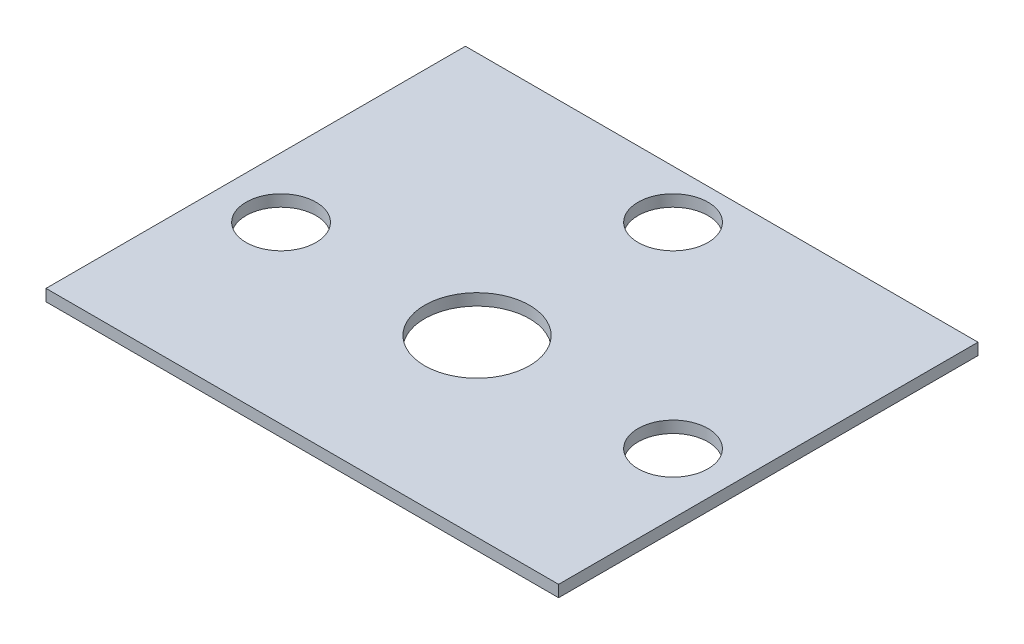
ISO-10303-21;
HEADER;
FILE_DESCRIPTION(('STEP AP214'),'2;1');
FILE_NAME('part.step','',(''),(''),'','','');
FILE_SCHEMA(('AUTOMOTIVE_DESIGN { 1 0 10303 214 1 1 1 1 }'));
ENDSEC;
DATA;
#1=APPLICATION_CONTEXT('core data for automotive mechanical design processes');
#2=APPLICATION_PROTOCOL_DEFINITION('international standard','automotive_design',2000,#1);
#3=PRODUCT_CONTEXT('',#1,'mechanical');
#4=PRODUCT('Part','Part','',(#3));
#5=PRODUCT_RELATED_PRODUCT_CATEGORY('part','',(#4));
#6=PRODUCT_DEFINITION_FORMATION('','',#4);
#7=PRODUCT_DEFINITION_CONTEXT('part definition',#1,'design');
#8=PRODUCT_DEFINITION('design','',#6,#7);
#9=PRODUCT_DEFINITION_SHAPE('','',#8);
#10=(LENGTH_UNIT() NAMED_UNIT(*) SI_UNIT(.MILLI.,.METRE.));
#11=(NAMED_UNIT(*) PLANE_ANGLE_UNIT() SI_UNIT($,.RADIAN.));
#12=(NAMED_UNIT(*) SI_UNIT($,.STERADIAN.) SOLID_ANGLE_UNIT());
#13=UNCERTAINTY_MEASURE_WITH_UNIT(LENGTH_MEASURE(1.E-05),#10,'distance_accuracy_value','');
#14=(GEOMETRIC_REPRESENTATION_CONTEXT(3) GLOBAL_UNCERTAINTY_ASSIGNED_CONTEXT((#13)) GLOBAL_UNIT_ASSIGNED_CONTEXT((#10,
#11,#12)) REPRESENTATION_CONTEXT('',''));
#15=CARTESIAN_POINT('',(0.,0.,0.));
#16=DIRECTION('',(0.,0.,1.));
#17=DIRECTION('',(1.,0.,0.));
#18=AXIS2_PLACEMENT_3D('',#15,#16,#17);
#19=CARTESIAN_POINT('',(0.,1.5875,0.));
#20=DIRECTION('',(0.,-1.,0.));
#21=DIRECTION('',(0.,0.,-1.));
#22=AXIS2_PLACEMENT_3D('',#19,#20,#21);
#23=PLANE('',#22);
#24=DIRECTION('',(0.,0.,-1.));
#25=VECTOR('',#24,1.);
#26=CARTESIAN_POINT('',(69.85,1.5875,57.15));
#27=LINE('',#26,#25);
#28=CARTESIAN_POINT('',(69.85,1.5875,57.15));
#29=VERTEX_POINT('',#28);
#30=CARTESIAN_POINT('',(69.85,1.5875,-57.15));
#31=VERTEX_POINT('',#30);
#32=EDGE_CURVE('E96',#29,#31,#27,.T.);
#33=ORIENTED_EDGE('',*,*,#32,.T.);
#34=DIRECTION('',(-1.,0.,0.));
#35=VECTOR('',#34,1.);
#36=CARTESIAN_POINT('',(-69.85,1.5875,-57.15));
#37=LINE('',#36,#35);
#38=CARTESIAN_POINT('',(-69.85,1.5875,-57.15));
#39=VERTEX_POINT('',#38);
#40=EDGE_CURVE('E91',#31,#39,#37,.T.);
#41=ORIENTED_EDGE('',*,*,#40,.T.);
#42=DIRECTION('',(0.,0.,1.));
#43=VECTOR('',#42,1.);
#44=CARTESIAN_POINT('',(-69.85,1.5875,57.15));
#45=LINE('',#44,#43);
#46=CARTESIAN_POINT('',(-69.85,1.5875,57.15));
#47=VERTEX_POINT('',#46);
#48=EDGE_CURVE('E94',#39,#47,#45,.T.);
#49=ORIENTED_EDGE('',*,*,#48,.T.);
#50=DIRECTION('',(1.,0.,0.));
#51=VECTOR('',#50,1.);
#52=CARTESIAN_POINT('',(-69.85,1.5875,57.15));
#53=LINE('',#52,#51);
#54=EDGE_CURVE('E61',#47,#29,#53,.T.);
#55=ORIENTED_EDGE('',*,*,#54,.T.);
#56=EDGE_LOOP('',(#33,#41,#49,#55));
#57=FACE_BOUND('',#56,.T.);
#58=CARTESIAN_POINT('',(0.,1.5875,9.525));
#59=DIRECTION('',(0.,1.,0.));
#60=DIRECTION('',(0.,0.,1.));
#61=AXIS2_PLACEMENT_3D('',#58,#59,#60);
#62=CIRCLE('',#61,14.2875);
#63=CARTESIAN_POINT('',(0.,1.5875,23.8125));
#64=VERTEX_POINT('',#63);
#65=EDGE_CURVE('E111',#64,#64,#62,.T.);
#66=ORIENTED_EDGE('',*,*,#65,.F.);
#67=EDGE_LOOP('',(#66));
#68=FACE_BOUND('',#67,.T.);
#69=CARTESIAN_POINT('',(0.,1.5875,-43.8912));
#70=DIRECTION('',(0.,1.,0.));
#71=DIRECTION('',(0.,0.,1.));
#72=AXIS2_PLACEMENT_3D('',#69,#70,#71);
#73=CIRCLE('',#72,9.52499999999999);
#74=CARTESIAN_POINT('',(0.,1.5875,-34.3662));
#75=VERTEX_POINT('',#74);
#76=EDGE_CURVE('E126',#75,#75,#73,.T.);
#77=ORIENTED_EDGE('',*,*,#76,.F.);
#78=EDGE_LOOP('',(#77));
#79=FACE_BOUND('',#78,.T.);
#80=CARTESIAN_POINT('',(-53.4162,1.5875,9.525));
#81=DIRECTION('',(0.,1.,0.));
#82=DIRECTION('',(0.,0.,1.));
#83=AXIS2_PLACEMENT_3D('',#80,#81,#82);
#84=CIRCLE('',#83,9.525);
#85=CARTESIAN_POINT('',(-53.4162,1.5875,19.05));
#86=VERTEX_POINT('',#85);
#87=EDGE_CURVE('E132',#86,#86,#84,.T.);
#88=ORIENTED_EDGE('',*,*,#87,.F.);
#89=EDGE_LOOP('',(#88));
#90=FACE_BOUND('',#89,.T.);
#91=CARTESIAN_POINT('',(53.4162,1.5875,9.525));
#92=DIRECTION('',(0.,1.,0.));
#93=DIRECTION('',(0.,0.,1.));
#94=AXIS2_PLACEMENT_3D('',#91,#92,#93);
#95=CIRCLE('',#94,9.52500000000002);
#96=CARTESIAN_POINT('',(53.4162,1.5875,19.05));
#97=VERTEX_POINT('',#96);
#98=EDGE_CURVE('E138',#97,#97,#95,.T.);
#99=ORIENTED_EDGE('',*,*,#98,.F.);
#100=EDGE_LOOP('',(#99));
#101=FACE_BOUND('',#100,.T.);
#102=ADVANCED_FACE('F44',(#57,#68,#79,#90,#101),#23,.F.);
#103=CARTESIAN_POINT('',(0.,-1.5875,0.));
#104=DIRECTION('',(0.,-1.,0.));
#105=DIRECTION('',(0.,0.,-1.));
#106=AXIS2_PLACEMENT_3D('',#103,#104,#105);
#107=PLANE('',#106);
#108=CARTESIAN_POINT('',(-53.4162,-1.5875,9.525));
#109=DIRECTION('',(0.,1.,0.));
#110=DIRECTION('',(0.,0.,1.));
#111=AXIS2_PLACEMENT_3D('',#108,#109,#110);
#112=CIRCLE('',#111,9.525);
#113=CARTESIAN_POINT('',(-53.4162,-1.5875,19.05));
#114=VERTEX_POINT('',#113);
#115=EDGE_CURVE('E135',#114,#114,#112,.T.);
#116=ORIENTED_EDGE('',*,*,#115,.T.);
#117=EDGE_LOOP('',(#116));
#118=FACE_BOUND('',#117,.T.);
#119=CARTESIAN_POINT('',(0.,-1.5875,9.525));
#120=DIRECTION('',(0.,1.,0.));
#121=DIRECTION('',(0.,0.,1.));
#122=AXIS2_PLACEMENT_3D('',#119,#120,#121);
#123=CIRCLE('',#122,14.2875);
#124=CARTESIAN_POINT('',(0.,-1.5875,23.8125));
#125=VERTEX_POINT('',#124);
#126=EDGE_CURVE('E123',#125,#125,#123,.T.);
#127=ORIENTED_EDGE('',*,*,#126,.T.);
#128=EDGE_LOOP('',(#127));
#129=FACE_BOUND('',#128,.T.);
#130=DIRECTION('',(0.,0.,-1.));
#131=VECTOR('',#130,1.);
#132=CARTESIAN_POINT('',(69.85,-1.5875,57.15));
#133=LINE('',#132,#131);
#134=CARTESIAN_POINT('',(69.85,-1.5875,57.15));
#135=VERTEX_POINT('',#134);
#136=CARTESIAN_POINT('',(69.85,-1.5875,-57.15));
#137=VERTEX_POINT('',#136);
#138=EDGE_CURVE('E108',#135,#137,#133,.T.);
#139=ORIENTED_EDGE('',*,*,#138,.F.);
#140=DIRECTION('',(1.,0.,0.));
#141=VECTOR('',#140,1.);
#142=CARTESIAN_POINT('',(-69.85,-1.5875,57.15));
#143=LINE('',#142,#141);
#144=CARTESIAN_POINT('',(-69.85,-1.5875,57.15));
#145=VERTEX_POINT('',#144);
#146=EDGE_CURVE('E84',#145,#135,#143,.T.);
#147=ORIENTED_EDGE('',*,*,#146,.F.);
#148=DIRECTION('',(0.,0.,1.));
#149=VECTOR('',#148,1.);
#150=CARTESIAN_POINT('',(-69.85,-1.5875,57.15));
#151=LINE('',#150,#149);
#152=CARTESIAN_POINT('',(-69.85,-1.5875,-57.15));
#153=VERTEX_POINT('',#152);
#154=EDGE_CURVE('E78',#153,#145,#151,.T.);
#155=ORIENTED_EDGE('',*,*,#154,.F.);
#156=DIRECTION('',(-1.,0.,0.));
#157=VECTOR('',#156,1.);
#158=CARTESIAN_POINT('',(-69.85,-1.5875,-57.15));
#159=LINE('',#158,#157);
#160=EDGE_CURVE('E100',#137,#153,#159,.T.);
#161=ORIENTED_EDGE('',*,*,#160,.F.);
#162=EDGE_LOOP('',(#139,#147,#155,#161));
#163=FACE_BOUND('',#162,.T.);
#164=CARTESIAN_POINT('',(0.,-1.5875,-43.8912));
#165=DIRECTION('',(0.,1.,0.));
#166=DIRECTION('',(0.,0.,1.));
#167=AXIS2_PLACEMENT_3D('',#164,#165,#166);
#168=CIRCLE('',#167,9.52499999999999);
#169=CARTESIAN_POINT('',(0.,-1.5875,-34.3662));
#170=VERTEX_POINT('',#169);
#171=EDGE_CURVE('E129',#170,#170,#168,.T.);
#172=ORIENTED_EDGE('',*,*,#171,.T.);
#173=EDGE_LOOP('',(#172));
#174=FACE_BOUND('',#173,.T.);
#175=CARTESIAN_POINT('',(53.4162,-1.5875,9.525));
#176=DIRECTION('',(0.,1.,0.));
#177=DIRECTION('',(0.,0.,1.));
#178=AXIS2_PLACEMENT_3D('',#175,#176,#177);
#179=CIRCLE('',#178,9.52500000000002);
#180=CARTESIAN_POINT('',(53.4162,-1.5875,19.05));
#181=VERTEX_POINT('',#180);
#182=EDGE_CURVE('E141',#181,#181,#179,.T.);
#183=ORIENTED_EDGE('',*,*,#182,.T.);
#184=EDGE_LOOP('',(#183));
#185=FACE_BOUND('',#184,.T.);
#186=ADVANCED_FACE('F119',(#118,#129,#163,#174,#185),#107,.T.);
#187=CARTESIAN_POINT('',(69.85,1.5875,57.15));
#188=DIRECTION('',(-1.,0.,0.));
#189=DIRECTION('',(0.,0.,1.));
#190=AXIS2_PLACEMENT_3D('',#187,#188,#189);
#191=PLANE('',#190);
#192=ORIENTED_EDGE('',*,*,#138,.T.);
#193=DIRECTION('',(0.,-1.,0.));
#194=VECTOR('',#193,1.);
#195=CARTESIAN_POINT('',(69.85,1.5875,-57.15));
#196=LINE('',#195,#194);
#197=EDGE_CURVE('E13',#31,#137,#196,.T.);
#198=ORIENTED_EDGE('',*,*,#197,.F.);
#199=ORIENTED_EDGE('',*,*,#32,.F.);
#200=DIRECTION('',(0.,-1.,0.));
#201=VECTOR('',#200,1.);
#202=CARTESIAN_POINT('',(69.85,1.5875,57.15));
#203=LINE('',#202,#201);
#204=EDGE_CURVE('E104',#29,#135,#203,.T.);
#205=ORIENTED_EDGE('',*,*,#204,.T.);
#206=EDGE_LOOP('',(#192,#198,#199,#205));
#207=FACE_BOUND('',#206,.T.);
#208=ADVANCED_FACE('F46',(#207),#191,.F.);
#209=CARTESIAN_POINT('',(-69.85,1.5875,-57.15));
#210=DIRECTION('',(0.,0.,1.));
#211=DIRECTION('',(1.,0.,0.));
#212=AXIS2_PLACEMENT_3D('',#209,#210,#211);
#213=PLANE('',#212);
#214=ORIENTED_EDGE('',*,*,#160,.T.);
#215=DIRECTION('',(0.,-1.,0.));
#216=VECTOR('',#215,1.);
#217=CARTESIAN_POINT('',(-69.85,1.5875,-57.15));
#218=LINE('',#217,#216);
#219=EDGE_CURVE('E53',#39,#153,#218,.T.);
#220=ORIENTED_EDGE('',*,*,#219,.F.);
#221=ORIENTED_EDGE('',*,*,#40,.F.);
#222=ORIENTED_EDGE('',*,*,#197,.T.);
#223=EDGE_LOOP('',(#214,#220,#221,#222));
#224=FACE_BOUND('',#223,.T.);
#225=ADVANCED_FACE('F99',(#224),#213,.F.);
#226=CARTESIAN_POINT('',(-69.85,1.5875,57.15));
#227=DIRECTION('',(1.,0.,0.));
#228=DIRECTION('',(0.,0.,-1.));
#229=AXIS2_PLACEMENT_3D('',#226,#227,#228);
#230=PLANE('',#229);
#231=ORIENTED_EDGE('',*,*,#154,.T.);
#232=DIRECTION('',(0.,-1.,0.));
#233=VECTOR('',#232,1.);
#234=CARTESIAN_POINT('',(-69.85,1.5875,57.15));
#235=LINE('',#234,#233);
#236=EDGE_CURVE('E101',#47,#145,#235,.T.);
#237=ORIENTED_EDGE('',*,*,#236,.F.);
#238=ORIENTED_EDGE('',*,*,#48,.F.);
#239=ORIENTED_EDGE('',*,*,#219,.T.);
#240=EDGE_LOOP('',(#231,#237,#238,#239));
#241=FACE_BOUND('',#240,.T.);
#242=ADVANCED_FACE('F102',(#241),#230,.F.);
#243=CARTESIAN_POINT('',(-69.85,1.5875,57.15));
#244=DIRECTION('',(0.,0.,-1.));
#245=DIRECTION('',(-1.,0.,0.));
#246=AXIS2_PLACEMENT_3D('',#243,#244,#245);
#247=PLANE('',#246);
#248=ORIENTED_EDGE('',*,*,#146,.T.);
#249=ORIENTED_EDGE('',*,*,#204,.F.);
#250=ORIENTED_EDGE('',*,*,#54,.F.);
#251=ORIENTED_EDGE('',*,*,#236,.T.);
#252=EDGE_LOOP('',(#248,#249,#250,#251));
#253=FACE_BOUND('',#252,.T.);
#254=ADVANCED_FACE('F116',(#253),#247,.F.);
#255=CARTESIAN_POINT('',(0.,1.5875,9.525));
#256=DIRECTION('',(0.,-1.,0.));
#257=DIRECTION('',(0.,0.,-1.));
#258=AXIS2_PLACEMENT_3D('',#255,#256,#257);
#259=CYLINDRICAL_SURFACE('',#258,14.2875);
#260=ORIENTED_EDGE('',*,*,#65,.T.);
#261=EDGE_LOOP('',(#260));
#262=FACE_BOUND('',#261,.T.);
#263=ORIENTED_EDGE('',*,*,#126,.F.);
#264=EDGE_LOOP('',(#263));
#265=FACE_BOUND('',#264,.T.);
#266=ADVANCED_FACE('F158',(#262,#265),#259,.F.);
#267=CARTESIAN_POINT('',(0.,1.5875,-43.8912));
#268=DIRECTION('',(0.,-1.,0.));
#269=DIRECTION('',(0.,0.,-1.));
#270=AXIS2_PLACEMENT_3D('',#267,#268,#269);
#271=CYLINDRICAL_SURFACE('',#270,9.52499999999999);
#272=ORIENTED_EDGE('',*,*,#76,.T.);
#273=EDGE_LOOP('',(#272));
#274=FACE_BOUND('',#273,.T.);
#275=ORIENTED_EDGE('',*,*,#171,.F.);
#276=EDGE_LOOP('',(#275));
#277=FACE_BOUND('',#276,.T.);
#278=ADVANCED_FACE('F204',(#274,#277),#271,.F.);
#279=CARTESIAN_POINT('',(-53.4162,1.5875,9.525));
#280=DIRECTION('',(0.,-1.,0.));
#281=DIRECTION('',(0.,0.,-1.));
#282=AXIS2_PLACEMENT_3D('',#279,#280,#281);
#283=CYLINDRICAL_SURFACE('',#282,9.525);
#284=ORIENTED_EDGE('',*,*,#87,.T.);
#285=EDGE_LOOP('',(#284));
#286=FACE_BOUND('',#285,.T.);
#287=ORIENTED_EDGE('',*,*,#115,.F.);
#288=EDGE_LOOP('',(#287));
#289=FACE_BOUND('',#288,.T.);
#290=ADVANCED_FACE('F212',(#286,#289),#283,.F.);
#291=CARTESIAN_POINT('',(53.4162,1.5875,9.525));
#292=DIRECTION('',(0.,-1.,0.));
#293=DIRECTION('',(0.,0.,-1.));
#294=AXIS2_PLACEMENT_3D('',#291,#292,#293);
#295=CYLINDRICAL_SURFACE('',#294,9.52500000000002);
#296=ORIENTED_EDGE('',*,*,#98,.T.);
#297=EDGE_LOOP('',(#296));
#298=FACE_BOUND('',#297,.T.);
#299=ORIENTED_EDGE('',*,*,#182,.F.);
#300=EDGE_LOOP('',(#299));
#301=FACE_BOUND('',#300,.T.);
#302=ADVANCED_FACE('F147',(#298,#301),#295,.F.);
#303=CLOSED_SHELL('',(#102,#186,#208,#225,#242,#254,#266,#278,#290,#302));
#304=MANIFOLD_SOLID_BREP('B2',#303);
#305=ADVANCED_BREP_SHAPE_REPRESENTATION('',(#18,#304),#14);
#306=SHAPE_DEFINITION_REPRESENTATION(#9,#305);
ENDSEC;
END-ISO-10303-21;
